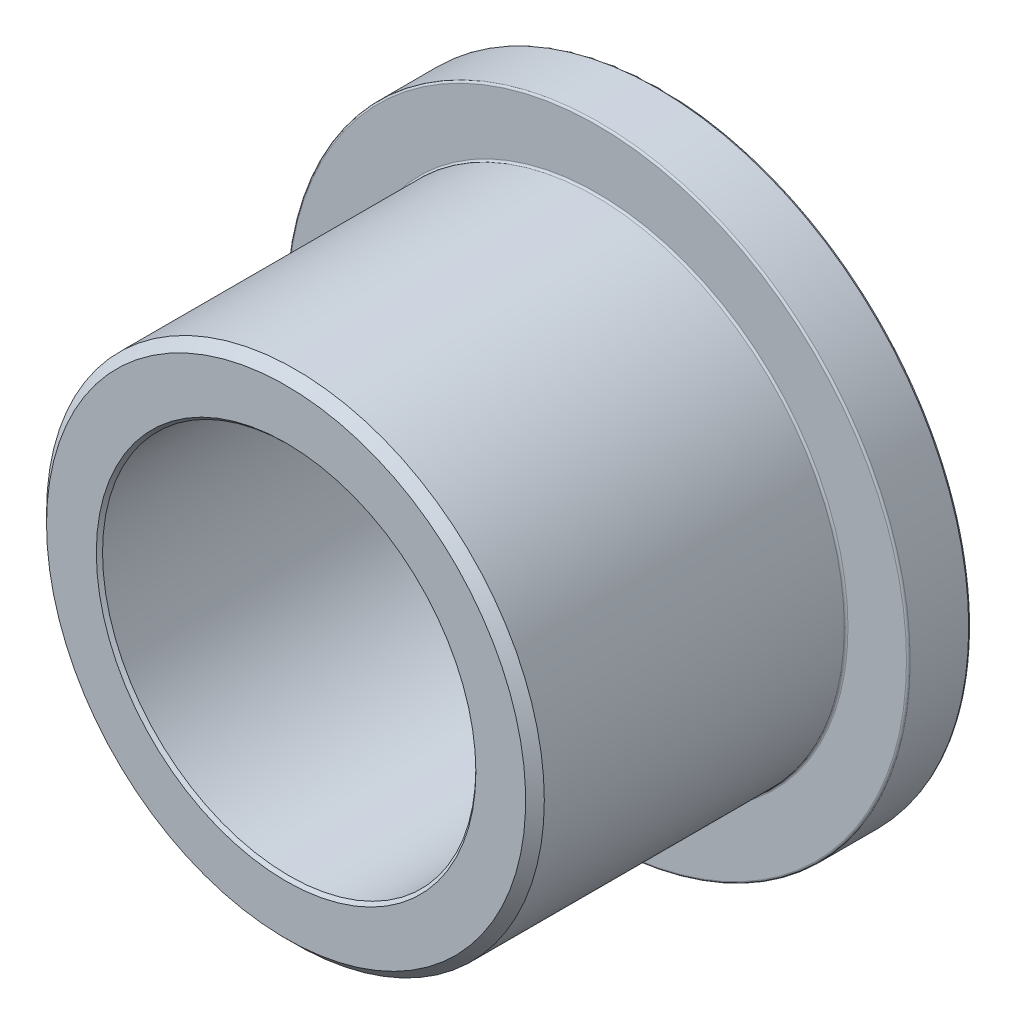
ISO-10303-21;
HEADER;
FILE_DESCRIPTION(('STEP AP214'),'2;1');
FILE_NAME('part.step','',(''),(''),'','','');
FILE_SCHEMA(('AUTOMOTIVE_DESIGN { 1 0 10303 214 1 1 1 1 }'));
ENDSEC;
DATA;
#1=APPLICATION_CONTEXT('core data for automotive mechanical design processes');
#2=APPLICATION_PROTOCOL_DEFINITION('international standard','automotive_design',2000,#1);
#3=PRODUCT_CONTEXT('',#1,'mechanical');
#4=PRODUCT('Part','Part','',(#3));
#5=PRODUCT_RELATED_PRODUCT_CATEGORY('part','',(#4));
#6=PRODUCT_DEFINITION_FORMATION('','',#4);
#7=PRODUCT_DEFINITION_CONTEXT('part definition',#1,'design');
#8=PRODUCT_DEFINITION('design','',#6,#7);
#9=PRODUCT_DEFINITION_SHAPE('','',#8);
#10=(LENGTH_UNIT() NAMED_UNIT(*) SI_UNIT(.MILLI.,.METRE.));
#11=(NAMED_UNIT(*) PLANE_ANGLE_UNIT() SI_UNIT($,.RADIAN.));
#12=(NAMED_UNIT(*) SI_UNIT($,.STERADIAN.) SOLID_ANGLE_UNIT());
#13=UNCERTAINTY_MEASURE_WITH_UNIT(LENGTH_MEASURE(1.E-05),#10,'distance_accuracy_value','');
#14=(GEOMETRIC_REPRESENTATION_CONTEXT(3) GLOBAL_UNCERTAINTY_ASSIGNED_CONTEXT((#13)) GLOBAL_UNIT_ASSIGNED_CONTEXT((#10,
#11,#12)) REPRESENTATION_CONTEXT('',''));
#15=CARTESIAN_POINT('',(0.,0.,0.));
#16=DIRECTION('',(0.,0.,1.));
#17=DIRECTION('',(1.,0.,0.));
#18=AXIS2_PLACEMENT_3D('',#15,#16,#17);
#19=CARTESIAN_POINT('',(0.,-4.7625,-4.7625));
#20=DIRECTION('',(0.,0.,-1.));
#21=DIRECTION('',(-1.,0.,0.));
#22=AXIS2_PLACEMENT_3D('',#19,#20,#21);
#23=PLANE('',#22);
#24=CARTESIAN_POINT('',(0.,0.,-4.7625));
#25=DIRECTION('',(0.,0.,-1.));
#26=DIRECTION('',(-1.,0.,0.));
#27=AXIS2_PLACEMENT_3D('',#24,#25,#26);
#28=CIRCLE('',#27,7.889875);
#29=CARTESIAN_POINT('',(-7.889875,0.,-4.7625));
#30=VERTEX_POINT('',#29);
#31=EDGE_CURVE('E52',#30,#30,#28,.T.);
#32=ORIENTED_EDGE('',*,*,#31,.T.);
#33=EDGE_LOOP('',(#32));
#34=FACE_BOUND('',#33,.T.);
#35=CARTESIAN_POINT('',(0.,0.,-4.7625));
#36=DIRECTION('',(0.,0.,-1.));
#37=DIRECTION('',(-1.,0.,0.));
#38=AXIS2_PLACEMENT_3D('',#35,#36,#37);
#39=CIRCLE('',#38,4.841875);
#40=CARTESIAN_POINT('',(-4.841875,0.,-4.7625));
#41=VERTEX_POINT('',#40);
#42=EDGE_CURVE('E72',#41,#41,#39,.F.);
#43=ORIENTED_EDGE('',*,*,#42,.T.);
#44=EDGE_LOOP('',(#43));
#45=FACE_BOUND('',#44,.T.);
#46=ADVANCED_FACE('F37',(#34,#45),#23,.T.);
#47=CARTESIAN_POINT('',(0.,0.,4.7625));
#48=DIRECTION('',(0.,0.,1.));
#49=DIRECTION('',(1.,0.,0.));
#50=AXIS2_PLACEMENT_3D('',#47,#48,#49);
#51=CYLINDRICAL_SURFACE('',#50,7.9375);
#52=CARTESIAN_POINT('',(0.,0.,-4.714875));
#53=DIRECTION('',(0.,0.,-1.));
#54=DIRECTION('',(-1.,0.,0.));
#55=AXIS2_PLACEMENT_3D('',#52,#53,#54);
#56=CIRCLE('',#55,7.9375);
#57=CARTESIAN_POINT('',(-7.9375,0.,-4.714875));
#58=VERTEX_POINT('',#57);
#59=EDGE_CURVE('E57',#58,#58,#56,.F.);
#60=ORIENTED_EDGE('',*,*,#59,.T.);
#61=EDGE_LOOP('',(#60));
#62=FACE_BOUND('',#61,.T.);
#63=CARTESIAN_POINT('',(0.,0.,-3.222625));
#64=DIRECTION('',(0.,0.,1.));
#65=DIRECTION('',(1.,0.,0.));
#66=AXIS2_PLACEMENT_3D('',#63,#64,#65);
#67=CIRCLE('',#66,7.9375);
#68=CARTESIAN_POINT('',(7.9375,0.,-3.222625));
#69=VERTEX_POINT('',#68);
#70=EDGE_CURVE('E60',#69,#69,#67,.F.);
#71=ORIENTED_EDGE('',*,*,#70,.T.);
#72=EDGE_LOOP('',(#71));
#73=FACE_BOUND('',#72,.T.);
#74=ADVANCED_FACE('F103',(#62,#73),#51,.T.);
#75=CARTESIAN_POINT('',(0.,-7.9375,-3.175));
#76=DIRECTION('',(0.,0.,1.));
#77=DIRECTION('',(1.,0.,0.));
#78=AXIS2_PLACEMENT_3D('',#75,#76,#77);
#79=PLANE('',#78);
#80=CARTESIAN_POINT('',(0.,0.,-3.175));
#81=DIRECTION('',(0.,0.,1.));
#82=DIRECTION('',(1.,0.,0.));
#83=AXIS2_PLACEMENT_3D('',#80,#81,#82);
#84=CIRCLE('',#83,6.397625);
#85=CARTESIAN_POINT('',(6.397625,0.,-3.175));
#86=VERTEX_POINT('',#85);
#87=EDGE_CURVE('E10',#86,#86,#84,.F.);
#88=ORIENTED_EDGE('',*,*,#87,.T.);
#89=EDGE_LOOP('',(#88));
#90=FACE_BOUND('',#89,.T.);
#91=CARTESIAN_POINT('',(0.,0.,-3.175));
#92=DIRECTION('',(0.,0.,1.));
#93=DIRECTION('',(1.,0.,0.));
#94=AXIS2_PLACEMENT_3D('',#91,#92,#93);
#95=CIRCLE('',#94,7.889875);
#96=CARTESIAN_POINT('',(7.889875,0.,-3.175));
#97=VERTEX_POINT('',#96);
#98=EDGE_CURVE('E44',#97,#97,#95,.T.);
#99=ORIENTED_EDGE('',*,*,#98,.T.);
#100=EDGE_LOOP('',(#99));
#101=FACE_BOUND('',#100,.T.);
#102=ADVANCED_FACE('F109',(#90,#101),#79,.T.);
#103=CARTESIAN_POINT('',(0.,0.,4.7625));
#104=DIRECTION('',(0.,0.,1.));
#105=DIRECTION('',(1.,0.,0.));
#106=AXIS2_PLACEMENT_3D('',#103,#104,#105);
#107=CYLINDRICAL_SURFACE('',#106,6.35);
#108=CARTESIAN_POINT('',(0.,0.,-3.127375));
#109=DIRECTION('',(0.,0.,1.));
#110=DIRECTION('',(1.,0.,0.));
#111=AXIS2_PLACEMENT_3D('',#108,#109,#110);
#112=CIRCLE('',#111,6.35);
#113=CARTESIAN_POINT('',(6.35,0.,-3.127375));
#114=VERTEX_POINT('',#113);
#115=EDGE_CURVE('E48',#114,#114,#112,.T.);
#116=ORIENTED_EDGE('',*,*,#115,.T.);
#117=EDGE_LOOP('',(#116));
#118=FACE_BOUND('',#117,.T.);
#119=CARTESIAN_POINT('',(0.,0.,4.52437500000001));
#120=DIRECTION('',(0.,0.,1.));
#121=DIRECTION('',(1.,0.,0.));
#122=AXIS2_PLACEMENT_3D('',#119,#120,#121);
#123=CIRCLE('',#122,6.35);
#124=CARTESIAN_POINT('',(-6.35,0.,4.52437500000001));
#125=VERTEX_POINT('',#124);
#126=EDGE_CURVE('E75',#125,#125,#123,.F.);
#127=ORIENTED_EDGE('',*,*,#126,.T.);
#128=EDGE_LOOP('',(#127));
#129=FACE_BOUND('',#128,.T.);
#130=ADVANCED_FACE('F116',(#118,#129),#107,.T.);
#131=CARTESIAN_POINT('',(0.,-6.35,4.7625));
#132=DIRECTION('',(0.,0.,1.));
#133=DIRECTION('',(1.,0.,0.));
#134=AXIS2_PLACEMENT_3D('',#131,#132,#133);
#135=PLANE('',#134);
#136=CARTESIAN_POINT('',(0.,0.,4.7625));
#137=DIRECTION('',(0.,0.,1.));
#138=DIRECTION('',(1.,0.,0.));
#139=AXIS2_PLACEMENT_3D('',#136,#137,#138);
#140=CIRCLE('',#139,4.841875);
#141=CARTESIAN_POINT('',(4.841875,0.,4.7625));
#142=VERTEX_POINT('',#141);
#143=EDGE_CURVE('E63',#142,#142,#140,.F.);
#144=ORIENTED_EDGE('',*,*,#143,.T.);
#145=EDGE_LOOP('',(#144));
#146=FACE_BOUND('',#145,.T.);
#147=CARTESIAN_POINT('',(0.,0.,4.7625));
#148=DIRECTION('',(0.,0.,1.));
#149=DIRECTION('',(1.,0.,0.));
#150=AXIS2_PLACEMENT_3D('',#147,#148,#149);
#151=CIRCLE('',#150,6.111875);
#152=CARTESIAN_POINT('',(-6.111875,0.,4.7625));
#153=VERTEX_POINT('',#152);
#154=EDGE_CURVE('E78',#153,#153,#151,.T.);
#155=ORIENTED_EDGE('',*,*,#154,.T.);
#156=EDGE_LOOP('',(#155));
#157=FACE_BOUND('',#156,.T.);
#158=ADVANCED_FACE('F82',(#146,#157),#135,.T.);
#159=CARTESIAN_POINT('',(0.,0.,4.7625));
#160=DIRECTION('',(0.,0.,1.));
#161=DIRECTION('',(1.,0.,0.));
#162=AXIS2_PLACEMENT_3D('',#159,#160,#161);
#163=CYLINDRICAL_SURFACE('',#162,4.7625);
#164=CARTESIAN_POINT('',(0.,0.,-4.683125));
#165=DIRECTION('',(0.,0.,-1.));
#166=DIRECTION('',(-1.,0.,0.));
#167=AXIS2_PLACEMENT_3D('',#164,#165,#166);
#168=CIRCLE('',#167,4.7625);
#169=CARTESIAN_POINT('',(-4.7625,0.,-4.683125));
#170=VERTEX_POINT('',#169);
#171=EDGE_CURVE('E66',#170,#170,#168,.T.);
#172=ORIENTED_EDGE('',*,*,#171,.T.);
#173=EDGE_LOOP('',(#172));
#174=FACE_BOUND('',#173,.T.);
#175=CARTESIAN_POINT('',(0.,0.,4.683125));
#176=DIRECTION('',(0.,0.,1.));
#177=DIRECTION('',(1.,0.,0.));
#178=AXIS2_PLACEMENT_3D('',#175,#176,#177);
#179=CIRCLE('',#178,4.7625);
#180=CARTESIAN_POINT('',(4.7625,0.,4.683125));
#181=VERTEX_POINT('',#180);
#182=EDGE_CURVE('E69',#181,#181,#179,.T.);
#183=ORIENTED_EDGE('',*,*,#182,.T.);
#184=EDGE_LOOP('',(#183));
#185=FACE_BOUND('',#184,.T.);
#186=ADVANCED_FACE('F87',(#174,#185),#163,.F.);
#187=CARTESIAN_POINT('',(0.,0.,4.7625));
#188=DIRECTION('',(0.,0.,-1.));
#189=DIRECTION('',(-1.,0.,0.));
#190=AXIS2_PLACEMENT_3D('',#187,#188,#189);
#191=CONICAL_SURFACE('',#190,6.111875,0.78539816339745);
#192=CARTESIAN_POINT('',(-6.35,0.,4.52437500000001));
#193=CARTESIAN_POINT('',(-6.34751953125,0.,4.52685546875001));
#194=CARTESIAN_POINT('',(-6.3450390625,0.,4.52933593750001));
#195=CARTESIAN_POINT('',(-6.340078125,0.,4.53429687500001));
#196=CARTESIAN_POINT('',(-6.33759765625,0.,4.53677734375001));
#197=CARTESIAN_POINT('',(-6.33263671875,0.,4.54173828125001));
#198=CARTESIAN_POINT('',(-6.33015625,0.,4.54421875000001));
#199=CARTESIAN_POINT('',(-6.3251953125,0.,4.54917968750001));
#200=CARTESIAN_POINT('',(-6.32271484375,0.,4.55166015625001));
#201=CARTESIAN_POINT('',(-6.31775390625,0.,4.55662109375001));
#202=CARTESIAN_POINT('',(-6.3152734375,0.,4.55910156250001));
#203=CARTESIAN_POINT('',(-6.3103125,0.,4.56406250000001));
#204=CARTESIAN_POINT('',(-6.30783203125,0.,4.56654296875001));
#205=CARTESIAN_POINT('',(-6.30287109375,0.,4.57150390625));
#206=CARTESIAN_POINT('',(-6.300390625,0.,4.57398437500001));
#207=CARTESIAN_POINT('',(-6.2954296875,0.,4.57894531250001));
#208=CARTESIAN_POINT('',(-6.29294921875,0.,4.58142578125001));
#209=CARTESIAN_POINT('',(-6.28798828125,0.,4.58638671875001));
#210=CARTESIAN_POINT('',(-6.2855078125,0.,4.58886718750001));
#211=CARTESIAN_POINT('',(-6.280546875,0.,4.593828125));
#212=CARTESIAN_POINT('',(-6.27806640625,0.,4.59630859375001));
#213=CARTESIAN_POINT('',(-6.27310546875,0.,4.60126953125001));
#214=CARTESIAN_POINT('',(-6.270625,0.,4.60375000000001));
#215=CARTESIAN_POINT('',(-6.2656640625,0.,4.60871093750001));
#216=CARTESIAN_POINT('',(-6.26318359375,0.,4.61119140625001));
#217=CARTESIAN_POINT('',(-6.25822265625,0.,4.61615234375));
#218=CARTESIAN_POINT('',(-6.2557421875,0.,4.6186328125));
#219=CARTESIAN_POINT('',(-6.25078125,0.,4.62359375000001));
#220=CARTESIAN_POINT('',(-6.24830078125,0.,4.62607421875));
#221=CARTESIAN_POINT('',(-6.24333984375,0.,4.63103515625));
#222=CARTESIAN_POINT('',(-6.240859375,0.,4.633515625));
#223=CARTESIAN_POINT('',(-6.2358984375,0.,4.6384765625));
#224=CARTESIAN_POINT('',(-6.23341796875,0.,4.64095703125));
#225=CARTESIAN_POINT('',(-6.22845703125,0.,4.64591796875));
#226=CARTESIAN_POINT('',(-6.2259765625,0.,4.6483984375));
#227=CARTESIAN_POINT('',(-6.221015625,0.,4.653359375));
#228=CARTESIAN_POINT('',(-6.21853515625,0.,4.65583984375));
#229=CARTESIAN_POINT('',(-6.21357421875,0.,4.66080078125));
#230=CARTESIAN_POINT('',(-6.21109375,0.,4.66328125));
#231=CARTESIAN_POINT('',(-6.2061328125,0.,4.6682421875));
#232=CARTESIAN_POINT('',(-6.20365234375,0.,4.67072265625));
#233=CARTESIAN_POINT('',(-6.19869140625,0.,4.67568359375));
#234=CARTESIAN_POINT('',(-6.1962109375,0.,4.6781640625));
#235=CARTESIAN_POINT('',(-6.19125,0.,4.683125));
#236=CARTESIAN_POINT('',(-6.18876953125,0.,4.68560546875));
#237=CARTESIAN_POINT('',(-6.18380859375,0.,4.69056640625));
#238=CARTESIAN_POINT('',(-6.181328125,0.,4.693046875));
#239=CARTESIAN_POINT('',(-6.1763671875,0.,4.6980078125));
#240=CARTESIAN_POINT('',(-6.17388671875,0.,4.70048828125));
#241=CARTESIAN_POINT('',(-6.16892578125,0.,4.70544921875));
#242=CARTESIAN_POINT('',(-6.1664453125,0.,4.7079296875));
#243=CARTESIAN_POINT('',(-6.161484375,0.,4.712890625));
#244=CARTESIAN_POINT('',(-6.15900390625,0.,4.71537109375));
#245=CARTESIAN_POINT('',(-6.15404296875,0.,4.72033203125));
#246=CARTESIAN_POINT('',(-6.1515625,0.,4.7228125));
#247=CARTESIAN_POINT('',(-6.1466015625,0.,4.7277734375));
#248=CARTESIAN_POINT('',(-6.14412109375,0.,4.73025390625));
#249=CARTESIAN_POINT('',(-6.13916015625,0.,4.73521484375));
#250=CARTESIAN_POINT('',(-6.1366796875,0.,4.7376953125));
#251=CARTESIAN_POINT('',(-6.13171875,0.,4.74265625));
#252=CARTESIAN_POINT('',(-6.12923828125,0.,4.74513671875));
#253=CARTESIAN_POINT('',(-6.12427734375,0.,4.75009765625));
#254=CARTESIAN_POINT('',(-6.121796875,0.,4.752578125));
#255=CARTESIAN_POINT('',(-6.1168359375,0.,4.7575390625));
#256=CARTESIAN_POINT('',(-6.11435546875,0.,4.76001953125));
#257=CARTESIAN_POINT('',(-6.111875,0.,4.7625));
#258=B_SPLINE_CURVE_WITH_KNOTS('',3,(#192,#193,#194,#195,#196,#197,#198,#199,#200,#201,#202,
#203,#204,#205,#206,#207,#208,#209,#210,#211,#212,#213,#214,#215,#216,#217,#218,#219,#220,#221,
#222,#223,#224,#225,#226,#227,#228,#229,#230,#231,#232,#233,#234,#235,#236,#237,#238,#239,#240,
#241,#242,#243,#244,#245,#246,#247,#248,#249,#250,#251,#252,#253,#254,#255,#256,#257),
.UNSPECIFIED.,.F.,.F.,(4,2,2,2,2,2,2,2,2,2,2,2,2,2,2,2,2,2,2,2,2,2,2,2,2,2,2,2,2,2,2,2,4),(0.,
0.0105237376418776,0.0210474752837557,0.0315712129256333,0.0420949505675108,0.052618688209389,
0.0631424258512665,0.0736661634931441,0.0841899011350223,0.0947136387768998,0.105237376418777,
0.115761114060656,0.126284851702533,0.136808589344411,0.147332326986289,0.157856064628166,
0.168379802270044,0.178903539911922,0.1894272775538,0.199951015195678,0.210474752837555,
0.220998490479433,0.231522228121311,0.242045965763189,0.252569703405066,0.263093441046944,
0.273617178688822,0.284140916330699,0.294664653972578,0.305188391614455,0.315712129256333,
0.326235866898211,0.336759604540088),.UNSPECIFIED.);
#259=EDGE_CURVE('BSEAM84',#125,#153,#258,.T.);
#260=ORIENTED_EDGE('',*,*,#126,.F.);
#261=ORIENTED_EDGE('',*,*,#154,.F.);
#262=ORIENTED_EDGE('',*,*,#259,.T.);
#263=ORIENTED_EDGE('',*,*,#259,.F.);
#264=EDGE_LOOP('',(#260,#262,#261,#263));
#265=FACE_BOUND('',#264,.T.);
#266=ADVANCED_FACE('F84',(#265),#191,.T.);
#267=CARTESIAN_POINT('',(0.,0.,-4.7625));
#268=DIRECTION('',(0.,0.,-1.));
#269=DIRECTION('',(-1.,0.,0.));
#270=AXIS2_PLACEMENT_3D('',#267,#268,#269);
#271=CONICAL_SURFACE('',#270,4.841875,0.785398163397448);
#272=ORIENTED_EDGE('',*,*,#171,.F.);
#273=EDGE_LOOP('',(#272));
#274=FACE_BOUND('',#273,.T.);
#275=ORIENTED_EDGE('',*,*,#42,.F.);
#276=EDGE_LOOP('',(#275));
#277=FACE_BOUND('',#276,.T.);
#278=ADVANCED_FACE('F86',(#274,#277),#271,.F.);
#279=CARTESIAN_POINT('',(0.,0.,4.683125));
#280=DIRECTION('',(0.,0.,1.));
#281=DIRECTION('',(1.,0.,0.));
#282=AXIS2_PLACEMENT_3D('',#279,#280,#281);
#283=CONICAL_SURFACE('',#282,4.7625,0.785398163397437);
#284=ORIENTED_EDGE('',*,*,#143,.F.);
#285=EDGE_LOOP('',(#284));
#286=FACE_BOUND('',#285,.T.);
#287=ORIENTED_EDGE('',*,*,#182,.F.);
#288=EDGE_LOOP('',(#287));
#289=FACE_BOUND('',#288,.T.);
#290=ADVANCED_FACE('F94',(#286,#289),#283,.F.);
#291=CARTESIAN_POINT('',(0.,0.,-4.714875));
#292=DIRECTION('',(0.,0.,-1.));
#293=DIRECTION('',(-1.,0.,0.));
#294=AXIS2_PLACEMENT_3D('',#291,#292,#293);
#295=TOROIDAL_SURFACE('',#294,7.889875,0.047625);
#296=ORIENTED_EDGE('',*,*,#31,.F.);
#297=EDGE_LOOP('',(#296));
#298=FACE_BOUND('',#297,.T.);
#299=ORIENTED_EDGE('',*,*,#59,.F.);
#300=EDGE_LOOP('',(#299));
#301=FACE_BOUND('',#300,.T.);
#302=ADVANCED_FACE('F126',(#298,#301),#295,.T.);
#303=CARTESIAN_POINT('',(0.,0.,-3.127375));
#304=DIRECTION('',(0.,0.,1.));
#305=DIRECTION('',(1.,0.,0.));
#306=AXIS2_PLACEMENT_3D('',#303,#304,#305);
#307=TOROIDAL_SURFACE('',#306,6.397625,0.047625);
#308=ORIENTED_EDGE('',*,*,#87,.F.);
#309=EDGE_LOOP('',(#308));
#310=FACE_BOUND('',#309,.T.);
#311=ORIENTED_EDGE('',*,*,#115,.F.);
#312=EDGE_LOOP('',(#311));
#313=FACE_BOUND('',#312,.T.);
#314=ADVANCED_FACE('F133',(#310,#313),#307,.F.);
#315=CARTESIAN_POINT('',(0.,0.,-3.222625));
#316=DIRECTION('',(0.,0.,1.));
#317=DIRECTION('',(1.,0.,0.));
#318=AXIS2_PLACEMENT_3D('',#315,#316,#317);
#319=TOROIDAL_SURFACE('',#318,7.889875,0.047625);
#320=ORIENTED_EDGE('',*,*,#70,.F.);
#321=EDGE_LOOP('',(#320));
#322=FACE_BOUND('',#321,.T.);
#323=ORIENTED_EDGE('',*,*,#98,.F.);
#324=EDGE_LOOP('',(#323));
#325=FACE_BOUND('',#324,.T.);
#326=ADVANCED_FACE('F39',(#322,#325),#319,.T.);
#327=CLOSED_SHELL('',(#46,#74,#102,#130,#158,#186,#266,#278,#290,#302,#314,#326));
#328=MANIFOLD_SOLID_BREP('B2',#327);
#329=ADVANCED_BREP_SHAPE_REPRESENTATION('',(#18,#328),#14);
#330=SHAPE_DEFINITION_REPRESENTATION(#9,#329);
ENDSEC;
END-ISO-10303-21;
